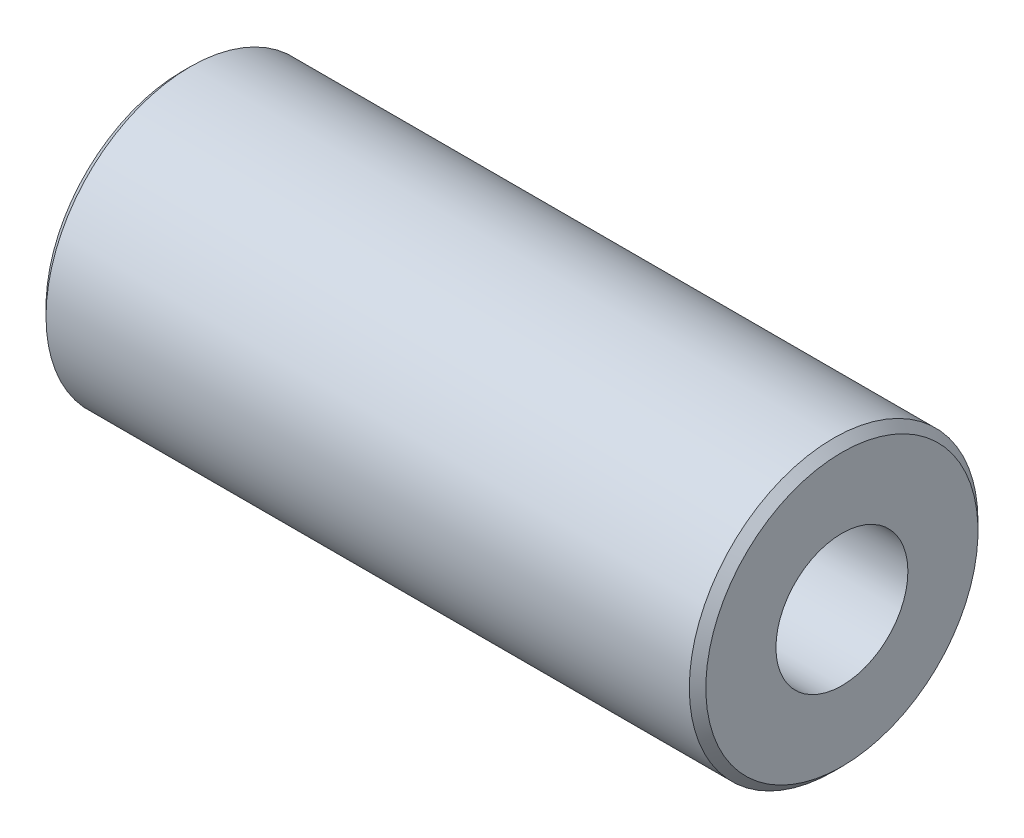
ISO-10303-21;
HEADER;
FILE_DESCRIPTION(('STEP AP214'),'2;1');
FILE_NAME('part.step','',(''),(''),'','','');
FILE_SCHEMA(('AUTOMOTIVE_DESIGN { 1 0 10303 214 1 1 1 1 }'));
ENDSEC;
DATA;
#1=APPLICATION_CONTEXT('core data for automotive mechanical design processes');
#2=APPLICATION_PROTOCOL_DEFINITION('international standard','automotive_design',2000,#1);
#3=PRODUCT_CONTEXT('',#1,'mechanical');
#4=PRODUCT('Part','Part','',(#3));
#5=PRODUCT_RELATED_PRODUCT_CATEGORY('part','',(#4));
#6=PRODUCT_DEFINITION_FORMATION('','',#4);
#7=PRODUCT_DEFINITION_CONTEXT('part definition',#1,'design');
#8=PRODUCT_DEFINITION('design','',#6,#7);
#9=PRODUCT_DEFINITION_SHAPE('','',#8);
#10=(LENGTH_UNIT() NAMED_UNIT(*) SI_UNIT(.MILLI.,.METRE.));
#11=(NAMED_UNIT(*) PLANE_ANGLE_UNIT() SI_UNIT($,.RADIAN.));
#12=(NAMED_UNIT(*) SI_UNIT($,.STERADIAN.) SOLID_ANGLE_UNIT());
#13=UNCERTAINTY_MEASURE_WITH_UNIT(LENGTH_MEASURE(1.E-05),#10,'distance_accuracy_value','');
#14=(GEOMETRIC_REPRESENTATION_CONTEXT(3) GLOBAL_UNCERTAINTY_ASSIGNED_CONTEXT((#13)) GLOBAL_UNIT_ASSIGNED_CONTEXT((#10,
#11,#12)) REPRESENTATION_CONTEXT('',''));
#15=CARTESIAN_POINT('',(0.,0.,0.));
#16=DIRECTION('',(0.,0.,1.));
#17=DIRECTION('',(1.,0.,0.));
#18=AXIS2_PLACEMENT_3D('',#15,#16,#17);
#19=CARTESIAN_POINT('',(4.,0.,0.));
#20=DIRECTION('',(-1.,0.,0.));
#21=DIRECTION('',(0.,-1.,0.));
#22=AXIS2_PLACEMENT_3D('',#19,#20,#21);
#23=PLANE('',#22);
#24=CARTESIAN_POINT('',(4.,0.,0.));
#25=DIRECTION('',(-1.,0.,0.));
#26=DIRECTION('',(0.,-1.,0.));
#27=AXIS2_PLACEMENT_3D('',#24,#25,#26);
#28=CIRCLE('',#27,1.65);
#29=CARTESIAN_POINT('',(4.,-1.65,0.));
#30=VERTEX_POINT('',#29);
#31=EDGE_CURVE('E50',#30,#30,#28,.F.);
#32=ORIENTED_EDGE('',*,*,#31,.T.);
#33=EDGE_LOOP('',(#32));
#34=FACE_BOUND('',#33,.T.);
#35=CARTESIAN_POINT('',(4.,0.,0.));
#36=DIRECTION('',(1.,0.,0.));
#37=DIRECTION('',(0.,0.,-1.));
#38=AXIS2_PLACEMENT_3D('',#35,#36,#37);
#39=CIRCLE('',#38,0.799999999999999);
#40=CARTESIAN_POINT('',(4.,0.,-0.799999999999999));
#41=VERTEX_POINT('',#40);
#42=EDGE_CURVE('E66',#41,#41,#39,.T.);
#43=ORIENTED_EDGE('',*,*,#42,.F.);
#44=EDGE_LOOP('',(#43));
#45=FACE_BOUND('',#44,.T.);
#46=ADVANCED_FACE('F42',(#34,#45),#23,.F.);
#47=CARTESIAN_POINT('',(-4.,0.,0.));
#48=DIRECTION('',(-1.,0.,0.));
#49=DIRECTION('',(0.,-1.,0.));
#50=AXIS2_PLACEMENT_3D('',#47,#48,#49);
#51=CYLINDRICAL_SURFACE('',#50,1.75);
#52=CARTESIAN_POINT('',(3.9,0.,0.));
#53=DIRECTION('',(-1.,0.,0.));
#54=DIRECTION('',(0.,-1.,0.));
#55=AXIS2_PLACEMENT_3D('',#52,#53,#54);
#56=CIRCLE('',#55,1.75);
#57=CARTESIAN_POINT('',(3.9,-1.75,0.));
#58=VERTEX_POINT('',#57);
#59=EDGE_CURVE('E54',#58,#58,#56,.T.);
#60=ORIENTED_EDGE('',*,*,#59,.T.);
#61=EDGE_LOOP('',(#60));
#62=FACE_BOUND('',#61,.T.);
#63=CARTESIAN_POINT('',(-3.9,0.,0.));
#64=DIRECTION('',(1.,0.,0.));
#65=DIRECTION('',(0.,1.,0.));
#66=AXIS2_PLACEMENT_3D('',#63,#64,#65);
#67=CIRCLE('',#66,1.75);
#68=CARTESIAN_POINT('',(-3.9,1.74999999999999,0.));
#69=VERTEX_POINT('',#68);
#70=EDGE_CURVE('E58',#69,#69,#67,.T.);
#71=ORIENTED_EDGE('',*,*,#70,.T.);
#72=EDGE_LOOP('',(#71));
#73=FACE_BOUND('',#72,.T.);
#74=ADVANCED_FACE('F73',(#62,#73),#51,.T.);
#75=CARTESIAN_POINT('',(-4.,1.74999999999999,0.));
#76=DIRECTION('',(1.,0.,0.));
#77=DIRECTION('',(0.,1.,0.));
#78=AXIS2_PLACEMENT_3D('',#75,#76,#77);
#79=PLANE('',#78);
#80=CARTESIAN_POINT('',(-4.,0.,0.));
#81=DIRECTION('',(1.,0.,0.));
#82=DIRECTION('',(0.,1.,0.));
#83=AXIS2_PLACEMENT_3D('',#80,#81,#82);
#84=CIRCLE('',#83,1.65);
#85=CARTESIAN_POINT('',(-4.,1.64999999999999,0.));
#86=VERTEX_POINT('',#85);
#87=EDGE_CURVE('E10',#86,#86,#84,.F.);
#88=ORIENTED_EDGE('',*,*,#87,.T.);
#89=EDGE_LOOP('',(#88));
#90=FACE_BOUND('',#89,.T.);
#91=CARTESIAN_POINT('',(-4.,0.,0.));
#92=DIRECTION('',(-1.,0.,0.));
#93=DIRECTION('',(0.,0.,1.));
#94=AXIS2_PLACEMENT_3D('',#91,#92,#93);
#95=CIRCLE('',#94,0.799999999999999);
#96=CARTESIAN_POINT('',(-4.,0.,0.799999999999999));
#97=VERTEX_POINT('',#96);
#98=EDGE_CURVE('E63',#97,#97,#95,.T.);
#99=ORIENTED_EDGE('',*,*,#98,.F.);
#100=EDGE_LOOP('',(#99));
#101=FACE_BOUND('',#100,.T.);
#102=ADVANCED_FACE('F78',(#90,#101),#79,.F.);
#103=CARTESIAN_POINT('',(-4.,0.,0.));
#104=DIRECTION('',(-1.,0.,0.));
#105=DIRECTION('',(0.,0.,1.));
#106=AXIS2_PLACEMENT_3D('',#103,#104,#105);
#107=CYLINDRICAL_SURFACE('',#106,0.799999999999998);
#108=ORIENTED_EDGE('',*,*,#98,.T.);
#109=EDGE_LOOP('',(#108));
#110=FACE_BOUND('',#109,.T.);
#111=ORIENTED_EDGE('',*,*,#42,.T.);
#112=EDGE_LOOP('',(#111));
#113=FACE_BOUND('',#112,.T.);
#114=ADVANCED_FACE('F70',(#110,#113),#107,.F.);
#115=CARTESIAN_POINT('',(3.9,0.,0.));
#116=DIRECTION('',(-1.,0.,0.));
#117=DIRECTION('',(0.,-1.,0.));
#118=AXIS2_PLACEMENT_3D('',#115,#116,#117);
#119=CONICAL_SURFACE('',#118,1.75,0.785398163397448);
#120=ORIENTED_EDGE('',*,*,#31,.F.);
#121=EDGE_LOOP('',(#120));
#122=FACE_BOUND('',#121,.T.);
#123=ORIENTED_EDGE('',*,*,#59,.F.);
#124=EDGE_LOOP('',(#123));
#125=FACE_BOUND('',#124,.T.);
#126=ADVANCED_FACE('F83',(#122,#125),#119,.T.);
#127=CARTESIAN_POINT('',(-4.,0.,0.));
#128=DIRECTION('',(1.,0.,0.));
#129=DIRECTION('',(0.,1.,0.));
#130=AXIS2_PLACEMENT_3D('',#127,#128,#129);
#131=CONICAL_SURFACE('',#130,1.65,0.785398163397443);
#132=ORIENTED_EDGE('',*,*,#70,.F.);
#133=EDGE_LOOP('',(#132));
#134=FACE_BOUND('',#133,.T.);
#135=ORIENTED_EDGE('',*,*,#87,.F.);
#136=EDGE_LOOP('',(#135));
#137=FACE_BOUND('',#136,.T.);
#138=ADVANCED_FACE('F45',(#134,#137),#131,.T.);
#139=CLOSED_SHELL('',(#46,#74,#102,#114,#126,#138));
#140=MANIFOLD_SOLID_BREP('B2',#139);
#141=ADVANCED_BREP_SHAPE_REPRESENTATION('',(#18,#140),#14);
#142=SHAPE_DEFINITION_REPRESENTATION(#9,#141);
ENDSEC;
END-ISO-10303-21;
